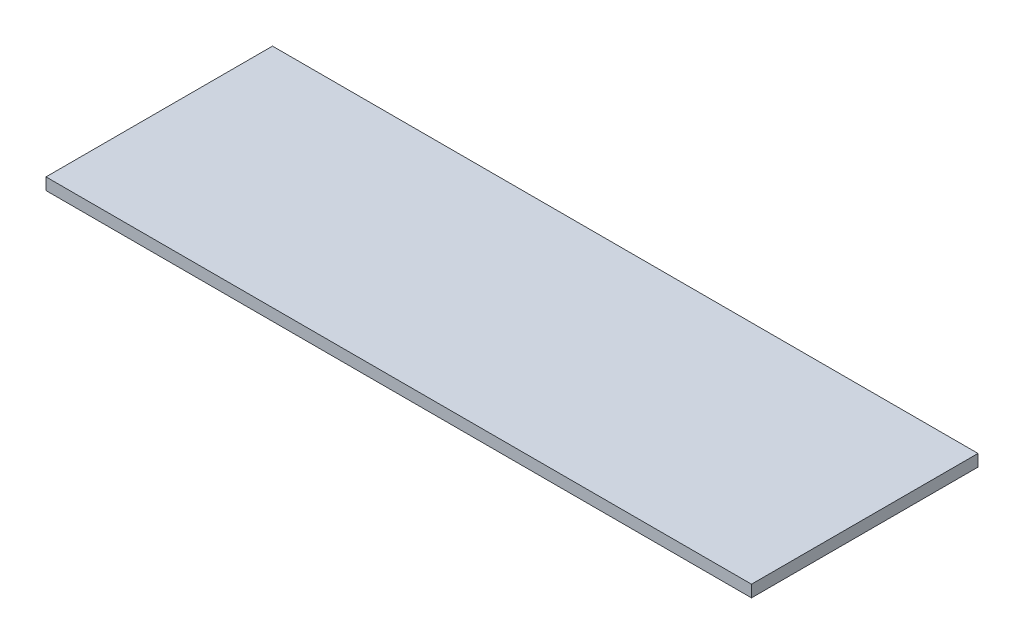
ISO-10303-21;
HEADER;
FILE_DESCRIPTION(('STEP AP214'),'2;1');
FILE_NAME('part.step','',(''),(''),'','','');
FILE_SCHEMA(('AUTOMOTIVE_DESIGN { 1 0 10303 214 1 1 1 1 }'));
ENDSEC;
DATA;
#1=APPLICATION_CONTEXT('core data for automotive mechanical design processes');
#2=APPLICATION_PROTOCOL_DEFINITION('international standard','automotive_design',2000,#1);
#3=PRODUCT_CONTEXT('',#1,'mechanical');
#4=PRODUCT('Part','Part','',(#3));
#5=PRODUCT_RELATED_PRODUCT_CATEGORY('part','',(#4));
#6=PRODUCT_DEFINITION_FORMATION('','',#4);
#7=PRODUCT_DEFINITION_CONTEXT('part definition',#1,'design');
#8=PRODUCT_DEFINITION('design','',#6,#7);
#9=PRODUCT_DEFINITION_SHAPE('','',#8);
#10=(LENGTH_UNIT() NAMED_UNIT(*) SI_UNIT(.MILLI.,.METRE.));
#11=(NAMED_UNIT(*) PLANE_ANGLE_UNIT() SI_UNIT($,.RADIAN.));
#12=(NAMED_UNIT(*) SI_UNIT($,.STERADIAN.) SOLID_ANGLE_UNIT());
#13=UNCERTAINTY_MEASURE_WITH_UNIT(LENGTH_MEASURE(1.E-05),#10,'distance_accuracy_value','');
#14=(GEOMETRIC_REPRESENTATION_CONTEXT(3) GLOBAL_UNCERTAINTY_ASSIGNED_CONTEXT((#13)) GLOBAL_UNIT_ASSIGNED_CONTEXT((#10,
#11,#12)) REPRESENTATION_CONTEXT('',''));
#15=CARTESIAN_POINT('',(0.,0.,0.));
#16=DIRECTION('',(0.,0.,1.));
#17=DIRECTION('',(1.,0.,0.));
#18=AXIS2_PLACEMENT_3D('',#15,#16,#17);
#19=CARTESIAN_POINT('',(-95.,3.2,-30.5));
#20=DIRECTION('',(1.,0.,0.));
#21=DIRECTION('',(0.,0.,-1.));
#22=AXIS2_PLACEMENT_3D('',#19,#20,#21);
#23=PLANE('',#22);
#24=DIRECTION('',(0.,0.,1.));
#25=VECTOR('',#24,1.);
#26=CARTESIAN_POINT('',(-95.,0.,-30.5));
#27=LINE('',#26,#25);
#28=CARTESIAN_POINT('',(-95.,0.,-30.5));
#29=VERTEX_POINT('',#28);
#30=CARTESIAN_POINT('',(-95.,0.,30.5));
#31=VERTEX_POINT('',#30);
#32=EDGE_CURVE('E96',#29,#31,#27,.T.);
#33=ORIENTED_EDGE('',*,*,#32,.T.);
#34=DIRECTION('',(0.,-1.,0.));
#35=VECTOR('',#34,1.);
#36=CARTESIAN_POINT('',(-95.,3.2,30.5));
#37=LINE('',#36,#35);
#38=CARTESIAN_POINT('',(-95.,3.2,30.5));
#39=VERTEX_POINT('',#38);
#40=EDGE_CURVE('E11',#39,#31,#37,.T.);
#41=ORIENTED_EDGE('',*,*,#40,.F.);
#42=DIRECTION('',(0.,0.,1.));
#43=VECTOR('',#42,1.);
#44=CARTESIAN_POINT('',(-95.,3.2,-30.5));
#45=LINE('',#44,#43);
#46=CARTESIAN_POINT('',(-95.,3.2,-30.5));
#47=VERTEX_POINT('',#46);
#48=EDGE_CURVE('E84',#47,#39,#45,.T.);
#49=ORIENTED_EDGE('',*,*,#48,.F.);
#50=DIRECTION('',(0.,-1.,0.));
#51=VECTOR('',#50,1.);
#52=CARTESIAN_POINT('',(-95.,3.2,-30.5));
#53=LINE('',#52,#51);
#54=EDGE_CURVE('E92',#47,#29,#53,.T.);
#55=ORIENTED_EDGE('',*,*,#54,.T.);
#56=EDGE_LOOP('',(#33,#41,#49,#55));
#57=FACE_BOUND('',#56,.T.);
#58=ADVANCED_FACE('F33',(#57),#23,.F.);
#59=CARTESIAN_POINT('',(95.,3.2,30.5));
#60=DIRECTION('',(0.,0.,-1.));
#61=DIRECTION('',(-1.,0.,0.));
#62=AXIS2_PLACEMENT_3D('',#59,#60,#61);
#63=PLANE('',#62);
#64=DIRECTION('',(1.,0.,0.));
#65=VECTOR('',#64,1.);
#66=CARTESIAN_POINT('',(95.,0.,30.5));
#67=LINE('',#66,#65);
#68=CARTESIAN_POINT('',(95.,0.,30.5));
#69=VERTEX_POINT('',#68);
#70=EDGE_CURVE('E88',#31,#69,#67,.T.);
#71=ORIENTED_EDGE('',*,*,#70,.T.);
#72=DIRECTION('',(0.,-1.,0.));
#73=VECTOR('',#72,1.);
#74=CARTESIAN_POINT('',(95.,3.2,30.5));
#75=LINE('',#74,#73);
#76=CARTESIAN_POINT('',(95.,3.2,30.5));
#77=VERTEX_POINT('',#76);
#78=EDGE_CURVE('E41',#77,#69,#75,.T.);
#79=ORIENTED_EDGE('',*,*,#78,.F.);
#80=DIRECTION('',(1.,0.,0.));
#81=VECTOR('',#80,1.);
#82=CARTESIAN_POINT('',(95.,3.2,30.5));
#83=LINE('',#82,#81);
#84=EDGE_CURVE('E79',#39,#77,#83,.T.);
#85=ORIENTED_EDGE('',*,*,#84,.F.);
#86=ORIENTED_EDGE('',*,*,#40,.T.);
#87=EDGE_LOOP('',(#71,#79,#85,#86));
#88=FACE_BOUND('',#87,.T.);
#89=ADVANCED_FACE('F87',(#88),#63,.F.);
#90=CARTESIAN_POINT('',(95.,3.2,-30.5));
#91=DIRECTION('',(-1.,0.,0.));
#92=DIRECTION('',(0.,0.,1.));
#93=AXIS2_PLACEMENT_3D('',#90,#91,#92);
#94=PLANE('',#93);
#95=DIRECTION('',(0.,0.,-1.));
#96=VECTOR('',#95,1.);
#97=CARTESIAN_POINT('',(95.,0.,-30.5));
#98=LINE('',#97,#96);
#99=CARTESIAN_POINT('',(95.,0.,-30.5));
#100=VERTEX_POINT('',#99);
#101=EDGE_CURVE('E66',#69,#100,#98,.T.);
#102=ORIENTED_EDGE('',*,*,#101,.T.);
#103=DIRECTION('',(0.,-1.,0.));
#104=VECTOR('',#103,1.);
#105=CARTESIAN_POINT('',(95.,3.2,-30.5));
#106=LINE('',#105,#104);
#107=CARTESIAN_POINT('',(95.,3.2,-30.5));
#108=VERTEX_POINT('',#107);
#109=EDGE_CURVE('E89',#108,#100,#106,.T.);
#110=ORIENTED_EDGE('',*,*,#109,.F.);
#111=DIRECTION('',(0.,0.,-1.));
#112=VECTOR('',#111,1.);
#113=CARTESIAN_POINT('',(95.,3.2,-30.5));
#114=LINE('',#113,#112);
#115=EDGE_CURVE('E82',#77,#108,#114,.T.);
#116=ORIENTED_EDGE('',*,*,#115,.F.);
#117=ORIENTED_EDGE('',*,*,#78,.T.);
#118=EDGE_LOOP('',(#102,#110,#116,#117));
#119=FACE_BOUND('',#118,.T.);
#120=ADVANCED_FACE('F90',(#119),#94,.F.);
#121=CARTESIAN_POINT('',(95.,3.2,-30.5));
#122=DIRECTION('',(0.,0.,1.));
#123=DIRECTION('',(1.,0.,0.));
#124=AXIS2_PLACEMENT_3D('',#121,#122,#123);
#125=PLANE('',#124);
#126=DIRECTION('',(-1.,0.,0.));
#127=VECTOR('',#126,1.);
#128=CARTESIAN_POINT('',(95.,0.,-30.5));
#129=LINE('',#128,#127);
#130=EDGE_CURVE('E72',#100,#29,#129,.T.);
#131=ORIENTED_EDGE('',*,*,#130,.T.);
#132=ORIENTED_EDGE('',*,*,#54,.F.);
#133=DIRECTION('',(-1.,0.,0.));
#134=VECTOR('',#133,1.);
#135=CARTESIAN_POINT('',(95.,3.2,-30.5));
#136=LINE('',#135,#134);
#137=EDGE_CURVE('E49',#108,#47,#136,.T.);
#138=ORIENTED_EDGE('',*,*,#137,.F.);
#139=ORIENTED_EDGE('',*,*,#109,.T.);
#140=EDGE_LOOP('',(#131,#132,#138,#139));
#141=FACE_BOUND('',#140,.T.);
#142=ADVANCED_FACE('F103',(#141),#125,.F.);
#143=CARTESIAN_POINT('',(0.,3.2,0.));
#144=DIRECTION('',(0.,-1.,0.));
#145=DIRECTION('',(0.,0.,-1.));
#146=AXIS2_PLACEMENT_3D('',#143,#144,#145);
#147=PLANE('',#146);
#148=ORIENTED_EDGE('',*,*,#48,.T.);
#149=ORIENTED_EDGE('',*,*,#84,.T.);
#150=ORIENTED_EDGE('',*,*,#115,.T.);
#151=ORIENTED_EDGE('',*,*,#137,.T.);
#152=EDGE_LOOP('',(#148,#149,#150,#151));
#153=FACE_BOUND('',#152,.T.);
#154=ADVANCED_FACE('F80',(#153),#147,.F.);
#155=CARTESIAN_POINT('',(0.,0.,0.));
#156=DIRECTION('',(0.,-1.,0.));
#157=DIRECTION('',(0.,0.,-1.));
#158=AXIS2_PLACEMENT_3D('',#155,#156,#157);
#159=PLANE('',#158);
#160=ORIENTED_EDGE('',*,*,#32,.F.);
#161=ORIENTED_EDGE('',*,*,#130,.F.);
#162=ORIENTED_EDGE('',*,*,#101,.F.);
#163=ORIENTED_EDGE('',*,*,#70,.F.);
#164=EDGE_LOOP('',(#160,#161,#162,#163));
#165=FACE_BOUND('',#164,.T.);
#166=ADVANCED_FACE('F106',(#165),#159,.T.);
#167=CLOSED_SHELL('',(#58,#89,#120,#142,#154,#166));
#168=MANIFOLD_SOLID_BREP('B2',#167);
#169=ADVANCED_BREP_SHAPE_REPRESENTATION('',(#18,#168),#14);
#170=SHAPE_DEFINITION_REPRESENTATION(#9,#169);
ENDSEC;
END-ISO-10303-21;
